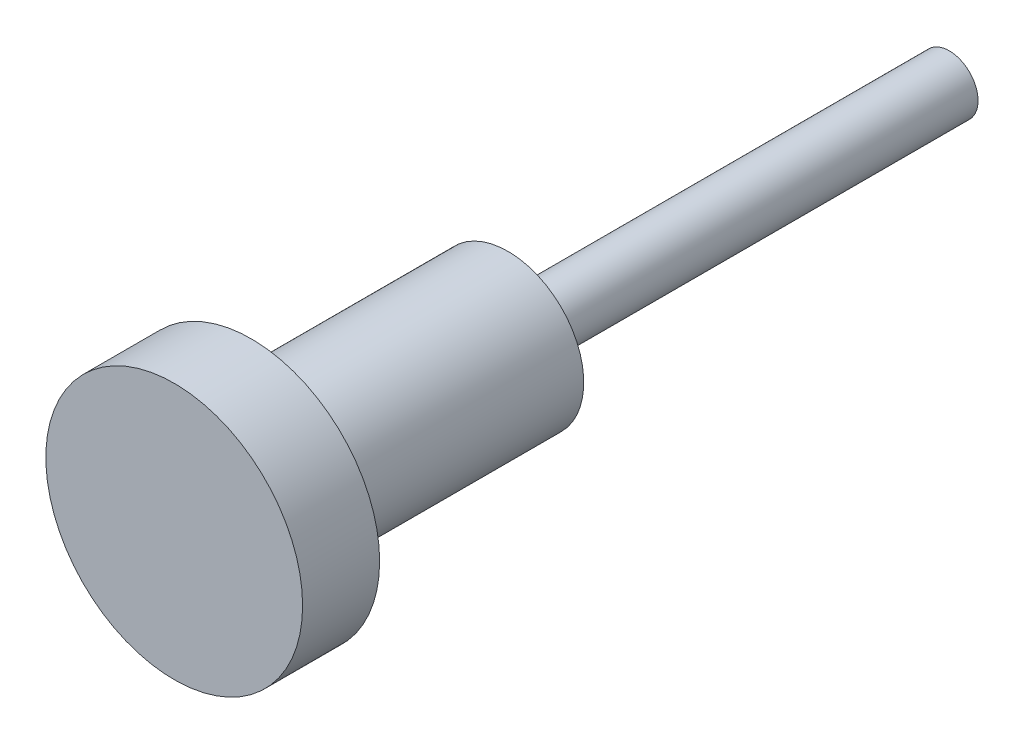
ISO-10303-21;
HEADER;
FILE_DESCRIPTION(('STEP AP214'),'2;1');
FILE_NAME('part.step','',(''),(''),'','','');
FILE_SCHEMA(('AUTOMOTIVE_DESIGN { 1 0 10303 214 1 1 1 1 }'));
ENDSEC;
DATA;
#1=APPLICATION_CONTEXT('core data for automotive mechanical design processes');
#2=APPLICATION_PROTOCOL_DEFINITION('international standard','automotive_design',2000,#1);
#3=PRODUCT_CONTEXT('',#1,'mechanical');
#4=PRODUCT('Part','Part','',(#3));
#5=PRODUCT_RELATED_PRODUCT_CATEGORY('part','',(#4));
#6=PRODUCT_DEFINITION_FORMATION('','',#4);
#7=PRODUCT_DEFINITION_CONTEXT('part definition',#1,'design');
#8=PRODUCT_DEFINITION('design','',#6,#7);
#9=PRODUCT_DEFINITION_SHAPE('','',#8);
#10=(LENGTH_UNIT() NAMED_UNIT(*) SI_UNIT(.MILLI.,.METRE.));
#11=(NAMED_UNIT(*) PLANE_ANGLE_UNIT() SI_UNIT($,.RADIAN.));
#12=(NAMED_UNIT(*) SI_UNIT($,.STERADIAN.) SOLID_ANGLE_UNIT());
#13=UNCERTAINTY_MEASURE_WITH_UNIT(LENGTH_MEASURE(1.E-05),#10,'distance_accuracy_value','');
#14=(GEOMETRIC_REPRESENTATION_CONTEXT(3) GLOBAL_UNCERTAINTY_ASSIGNED_CONTEXT((#13)) GLOBAL_UNIT_ASSIGNED_CONTEXT((#10,
#11,#12)) REPRESENTATION_CONTEXT('',''));
#15=CARTESIAN_POINT('',(0.,0.,0.));
#16=DIRECTION('',(0.,0.,1.));
#17=DIRECTION('',(1.,0.,0.));
#18=AXIS2_PLACEMENT_3D('',#15,#16,#17);
#19=CARTESIAN_POINT('',(0.,0.,3.));
#20=DIRECTION('',(0.,0.,-1.));
#21=DIRECTION('',(-1.,0.,0.));
#22=AXIS2_PLACEMENT_3D('',#19,#20,#21);
#23=CYLINDRICAL_SURFACE('',#22,5.);
#24=CARTESIAN_POINT('',(0.,0.,3.));
#25=DIRECTION('',(0.,0.,1.));
#26=DIRECTION('',(1.,0.,0.));
#27=AXIS2_PLACEMENT_3D('',#24,#25,#26);
#28=CIRCLE('',#27,5.);
#29=CARTESIAN_POINT('',(5.,0.,3.));
#30=VERTEX_POINT('',#29);
#31=EDGE_CURVE('E51',#30,#30,#28,.T.);
#32=ORIENTED_EDGE('',*,*,#31,.F.);
#33=EDGE_LOOP('',(#32));
#34=FACE_BOUND('',#33,.T.);
#35=CARTESIAN_POINT('',(0.,0.,0.));
#36=DIRECTION('',(0.,0.,1.));
#37=DIRECTION('',(1.,0.,0.));
#38=AXIS2_PLACEMENT_3D('',#35,#36,#37);
#39=CIRCLE('',#38,5.);
#40=CARTESIAN_POINT('',(5.,0.,0.));
#41=VERTEX_POINT('',#40);
#42=EDGE_CURVE('E42',#41,#41,#39,.T.);
#43=ORIENTED_EDGE('',*,*,#42,.T.);
#44=EDGE_LOOP('',(#43));
#45=FACE_BOUND('',#44,.T.);
#46=ADVANCED_FACE('F39',(#34,#45),#23,.T.);
#47=CARTESIAN_POINT('',(0.,0.,3.));
#48=DIRECTION('',(0.,0.,1.));
#49=DIRECTION('',(1.,0.,0.));
#50=AXIS2_PLACEMENT_3D('',#47,#48,#49);
#51=PLANE('',#50);
#52=ORIENTED_EDGE('',*,*,#31,.T.);
#53=EDGE_LOOP('',(#52));
#54=FACE_BOUND('',#53,.T.);
#55=ADVANCED_FACE('F68',(#54),#51,.T.);
#56=CARTESIAN_POINT('',(0.,0.,0.));
#57=DIRECTION('',(0.,0.,1.));
#58=DIRECTION('',(1.,0.,0.));
#59=AXIS2_PLACEMENT_3D('',#56,#57,#58);
#60=PLANE('',#59);
#61=CARTESIAN_POINT('',(0.,0.,0.));
#62=DIRECTION('',(0.,0.,-1.));
#63=DIRECTION('',(-1.,0.,0.));
#64=AXIS2_PLACEMENT_3D('',#61,#62,#63);
#65=CIRCLE('',#64,2.94881138630525);
#66=CARTESIAN_POINT('',(-2.94881138630525,0.,0.));
#67=VERTEX_POINT('',#66);
#68=EDGE_CURVE('E46',#67,#67,#65,.T.);
#69=ORIENTED_EDGE('',*,*,#68,.F.);
#70=EDGE_LOOP('',(#69));
#71=FACE_BOUND('',#70,.T.);
#72=ORIENTED_EDGE('',*,*,#42,.F.);
#73=EDGE_LOOP('',(#72));
#74=FACE_BOUND('',#73,.T.);
#75=ADVANCED_FACE('F65',(#71,#74),#60,.F.);
#76=CARTESIAN_POINT('',(0.,0.,-10.));
#77=DIRECTION('',(0.,0.,1.));
#78=DIRECTION('',(1.,0.,0.));
#79=AXIS2_PLACEMENT_3D('',#76,#77,#78);
#80=CYLINDRICAL_SURFACE('',#79,2.94881138630525);
#81=CARTESIAN_POINT('',(0.,0.,-10.));
#82=DIRECTION('',(0.,0.,-1.));
#83=DIRECTION('',(-1.,0.,0.));
#84=AXIS2_PLACEMENT_3D('',#81,#82,#83);
#85=CIRCLE('',#84,2.94881138630525);
#86=CARTESIAN_POINT('',(-2.94881138630525,0.,-10.));
#87=VERTEX_POINT('',#86);
#88=EDGE_CURVE('E56',#87,#87,#85,.T.);
#89=ORIENTED_EDGE('',*,*,#88,.F.);
#90=EDGE_LOOP('',(#89));
#91=FACE_BOUND('',#90,.T.);
#92=ORIENTED_EDGE('',*,*,#68,.T.);
#93=EDGE_LOOP('',(#92));
#94=FACE_BOUND('',#93,.T.);
#95=ADVANCED_FACE('F67',(#91,#94),#80,.T.);
#96=CARTESIAN_POINT('',(0.,0.,-10.));
#97=DIRECTION('',(0.,0.,-1.));
#98=DIRECTION('',(-1.,0.,0.));
#99=AXIS2_PLACEMENT_3D('',#96,#97,#98);
#100=PLANE('',#99);
#101=CARTESIAN_POINT('',(0.,0.,-10.));
#102=DIRECTION('',(0.,0.,-1.));
#103=DIRECTION('',(-1.,0.,0.));
#104=AXIS2_PLACEMENT_3D('',#101,#102,#103);
#105=CIRCLE('',#104,1.12226104919827);
#106=CARTESIAN_POINT('',(-1.12226104919827,0.,-10.));
#107=VERTEX_POINT('',#106);
#108=EDGE_CURVE('E10',#107,#107,#105,.T.);
#109=ORIENTED_EDGE('',*,*,#108,.F.);
#110=EDGE_LOOP('',(#109));
#111=FACE_BOUND('',#110,.T.);
#112=ORIENTED_EDGE('',*,*,#88,.T.);
#113=EDGE_LOOP('',(#112));
#114=FACE_BOUND('',#113,.T.);
#115=ADVANCED_FACE('F74',(#111,#114),#100,.T.);
#116=CARTESIAN_POINT('',(0.,0.,-27.1825416168257));
#117=DIRECTION('',(0.,0.,1.));
#118=DIRECTION('',(1.,0.,0.));
#119=AXIS2_PLACEMENT_3D('',#116,#117,#118);
#120=CYLINDRICAL_SURFACE('',#119,1.12226104919827);
#121=CARTESIAN_POINT('',(0.,0.,-27.1825416168257));
#122=DIRECTION('',(0.,0.,-1.));
#123=DIRECTION('',(-1.,0.,0.));
#124=AXIS2_PLACEMENT_3D('',#121,#122,#123);
#125=CIRCLE('',#124,1.12226104919827);
#126=CARTESIAN_POINT('',(-1.12226104919827,0.,-27.1825416168257));
#127=VERTEX_POINT('',#126);
#128=EDGE_CURVE('E55',#127,#127,#125,.T.);
#129=ORIENTED_EDGE('',*,*,#128,.F.);
#130=EDGE_LOOP('',(#129));
#131=FACE_BOUND('',#130,.T.);
#132=ORIENTED_EDGE('',*,*,#108,.T.);
#133=EDGE_LOOP('',(#132));
#134=FACE_BOUND('',#133,.T.);
#135=ADVANCED_FACE('F108',(#131,#134),#120,.T.);
#136=CARTESIAN_POINT('',(0.,0.,-27.1825416168257));
#137=DIRECTION('',(0.,0.,-1.));
#138=DIRECTION('',(-1.,0.,0.));
#139=AXIS2_PLACEMENT_3D('',#136,#137,#138);
#140=PLANE('',#139);
#141=ORIENTED_EDGE('',*,*,#128,.T.);
#142=EDGE_LOOP('',(#141));
#143=FACE_BOUND('',#142,.T.);
#144=ADVANCED_FACE('F118',(#143),#140,.T.);
#145=CLOSED_SHELL('',(#46,#55,#75,#95,#115,#135,#144));
#146=MANIFOLD_SOLID_BREP('B2',#145);
#147=ADVANCED_BREP_SHAPE_REPRESENTATION('',(#18,#146),#14);
#148=SHAPE_DEFINITION_REPRESENTATION(#9,#147);
ENDSEC;
END-ISO-10303-21;
